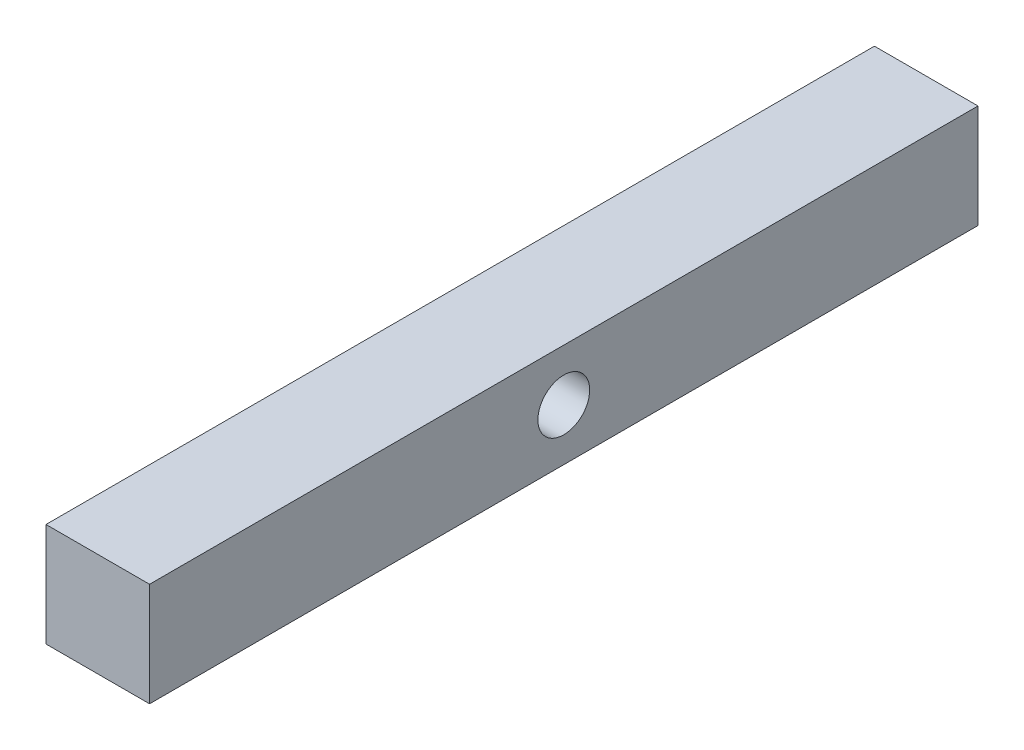
ISO-10303-21;
HEADER;
FILE_DESCRIPTION(('STEP AP214'),'2;1');
FILE_NAME('part.step','',(''),(''),'','','');
FILE_SCHEMA(('AUTOMOTIVE_DESIGN { 1 0 10303 214 1 1 1 1 }'));
ENDSEC;
DATA;
#1=APPLICATION_CONTEXT('core data for automotive mechanical design processes');
#2=APPLICATION_PROTOCOL_DEFINITION('international standard','automotive_design',2000,#1);
#3=PRODUCT_CONTEXT('',#1,'mechanical');
#4=PRODUCT('Part','Part','',(#3));
#5=PRODUCT_RELATED_PRODUCT_CATEGORY('part','',(#4));
#6=PRODUCT_DEFINITION_FORMATION('','',#4);
#7=PRODUCT_DEFINITION_CONTEXT('part definition',#1,'design');
#8=PRODUCT_DEFINITION('design','',#6,#7);
#9=PRODUCT_DEFINITION_SHAPE('','',#8);
#10=(LENGTH_UNIT() NAMED_UNIT(*) SI_UNIT(.MILLI.,.METRE.));
#11=(NAMED_UNIT(*) PLANE_ANGLE_UNIT() SI_UNIT($,.RADIAN.));
#12=(NAMED_UNIT(*) SI_UNIT($,.STERADIAN.) SOLID_ANGLE_UNIT());
#13=UNCERTAINTY_MEASURE_WITH_UNIT(LENGTH_MEASURE(1.E-05),#10,'distance_accuracy_value','');
#14=(GEOMETRIC_REPRESENTATION_CONTEXT(3) GLOBAL_UNCERTAINTY_ASSIGNED_CONTEXT((#13)) GLOBAL_UNIT_ASSIGNED_CONTEXT((#10,
#11,#12)) REPRESENTATION_CONTEXT('',''));
#15=CARTESIAN_POINT('',(0.,0.,0.));
#16=DIRECTION('',(0.,0.,1.));
#17=DIRECTION('',(1.,0.,0.));
#18=AXIS2_PLACEMENT_3D('',#15,#16,#17);
#19=CARTESIAN_POINT('',(20.,-20.,320.));
#20=DIRECTION('',(-1.,0.,0.));
#21=DIRECTION('',(0.,0.,1.));
#22=AXIS2_PLACEMENT_3D('',#19,#20,#21);
#23=PLANE('',#22);
#24=CARTESIAN_POINT('',(20.,0.,160.));
#25=DIRECTION('',(1.,0.,0.));
#26=DIRECTION('',(0.,0.,-1.));
#27=AXIS2_PLACEMENT_3D('',#24,#25,#26);
#28=CIRCLE('',#27,9.99999999999998);
#29=CARTESIAN_POINT('',(20.,0.,150.));
#30=VERTEX_POINT('',#29);
#31=EDGE_CURVE('E111',#30,#30,#28,.T.);
#32=ORIENTED_EDGE('',*,*,#31,.F.);
#33=EDGE_LOOP('',(#32));
#34=FACE_BOUND('',#33,.T.);
#35=DIRECTION('',(0.,1.,0.));
#36=VECTOR('',#35,1.);
#37=CARTESIAN_POINT('',(20.,-20.,0.));
#38=LINE('',#37,#36);
#39=CARTESIAN_POINT('',(20.,-20.,0.));
#40=VERTEX_POINT('',#39);
#41=CARTESIAN_POINT('',(20.,20.,0.));
#42=VERTEX_POINT('',#41);
#43=EDGE_CURVE('E98',#40,#42,#38,.T.);
#44=ORIENTED_EDGE('',*,*,#43,.T.);
#45=DIRECTION('',(0.,0.,-1.));
#46=VECTOR('',#45,1.);
#47=CARTESIAN_POINT('',(20.,20.,320.));
#48=LINE('',#47,#46);
#49=CARTESIAN_POINT('',(20.,20.,320.));
#50=VERTEX_POINT('',#49);
#51=EDGE_CURVE('E11',#50,#42,#48,.T.);
#52=ORIENTED_EDGE('',*,*,#51,.F.);
#53=DIRECTION('',(0.,1.,0.));
#54=VECTOR('',#53,1.);
#55=CARTESIAN_POINT('',(20.,-20.,320.));
#56=LINE('',#55,#54);
#57=CARTESIAN_POINT('',(20.,-20.,320.));
#58=VERTEX_POINT('',#57);
#59=EDGE_CURVE('E85',#58,#50,#56,.T.);
#60=ORIENTED_EDGE('',*,*,#59,.F.);
#61=DIRECTION('',(0.,0.,-1.));
#62=VECTOR('',#61,1.);
#63=CARTESIAN_POINT('',(20.,-20.,320.));
#64=LINE('',#63,#62);
#65=EDGE_CURVE('E94',#58,#40,#64,.T.);
#66=ORIENTED_EDGE('',*,*,#65,.T.);
#67=EDGE_LOOP('',(#44,#52,#60,#66));
#68=FACE_BOUND('',#67,.T.);
#69=ADVANCED_FACE('F33',(#34,#68),#23,.F.);
#70=CARTESIAN_POINT('',(-20.,20.,320.));
#71=DIRECTION('',(0.,-1.,0.));
#72=DIRECTION('',(0.,0.,-1.));
#73=AXIS2_PLACEMENT_3D('',#70,#71,#72);
#74=PLANE('',#73);
#75=DIRECTION('',(-1.,0.,0.));
#76=VECTOR('',#75,1.);
#77=CARTESIAN_POINT('',(-20.,20.,0.));
#78=LINE('',#77,#76);
#79=CARTESIAN_POINT('',(-20.,20.,0.));
#80=VERTEX_POINT('',#79);
#81=EDGE_CURVE('E89',#42,#80,#78,.T.);
#82=ORIENTED_EDGE('',*,*,#81,.T.);
#83=DIRECTION('',(0.,0.,-1.));
#84=VECTOR('',#83,1.);
#85=CARTESIAN_POINT('',(-20.,20.,320.));
#86=LINE('',#85,#84);
#87=CARTESIAN_POINT('',(-20.,20.,320.));
#88=VERTEX_POINT('',#87);
#89=EDGE_CURVE('E42',#88,#80,#86,.T.);
#90=ORIENTED_EDGE('',*,*,#89,.F.);
#91=DIRECTION('',(-1.,0.,0.));
#92=VECTOR('',#91,1.);
#93=CARTESIAN_POINT('',(-20.,20.,320.));
#94=LINE('',#93,#92);
#95=EDGE_CURVE('E80',#50,#88,#94,.T.);
#96=ORIENTED_EDGE('',*,*,#95,.F.);
#97=ORIENTED_EDGE('',*,*,#51,.T.);
#98=EDGE_LOOP('',(#82,#90,#96,#97));
#99=FACE_BOUND('',#98,.T.);
#100=ADVANCED_FACE('F88',(#99),#74,.F.);
#101=CARTESIAN_POINT('',(-20.,-20.,320.));
#102=DIRECTION('',(1.,0.,0.));
#103=DIRECTION('',(0.,0.,-1.));
#104=AXIS2_PLACEMENT_3D('',#101,#102,#103);
#105=PLANE('',#104);
#106=CARTESIAN_POINT('',(-20.,0.,160.));
#107=DIRECTION('',(1.,0.,0.));
#108=DIRECTION('',(0.,0.,-1.));
#109=AXIS2_PLACEMENT_3D('',#106,#107,#108);
#110=CIRCLE('',#109,9.99999999999998);
#111=CARTESIAN_POINT('',(-20.,0.,150.));
#112=VERTEX_POINT('',#111);
#113=EDGE_CURVE('E36',#112,#112,#110,.T.);
#114=ORIENTED_EDGE('',*,*,#113,.T.);
#115=EDGE_LOOP('',(#114));
#116=FACE_BOUND('',#115,.T.);
#117=DIRECTION('',(0.,-1.,0.));
#118=VECTOR('',#117,1.);
#119=CARTESIAN_POINT('',(-20.,-20.,0.));
#120=LINE('',#119,#118);
#121=CARTESIAN_POINT('',(-20.,-20.,0.));
#122=VERTEX_POINT('',#121);
#123=EDGE_CURVE('E67',#80,#122,#120,.T.);
#124=ORIENTED_EDGE('',*,*,#123,.T.);
#125=DIRECTION('',(0.,0.,-1.));
#126=VECTOR('',#125,1.);
#127=CARTESIAN_POINT('',(-20.,-20.,320.));
#128=LINE('',#127,#126);
#129=CARTESIAN_POINT('',(-20.,-20.,320.));
#130=VERTEX_POINT('',#129);
#131=EDGE_CURVE('E90',#130,#122,#128,.T.);
#132=ORIENTED_EDGE('',*,*,#131,.F.);
#133=DIRECTION('',(0.,-1.,0.));
#134=VECTOR('',#133,1.);
#135=CARTESIAN_POINT('',(-20.,-20.,320.));
#136=LINE('',#135,#134);
#137=EDGE_CURVE('E83',#88,#130,#136,.T.);
#138=ORIENTED_EDGE('',*,*,#137,.F.);
#139=ORIENTED_EDGE('',*,*,#89,.T.);
#140=EDGE_LOOP('',(#124,#132,#138,#139));
#141=FACE_BOUND('',#140,.T.);
#142=ADVANCED_FACE('F92',(#116,#141),#105,.F.);
#143=CARTESIAN_POINT('',(-20.,-20.,320.));
#144=DIRECTION('',(0.,1.,0.));
#145=DIRECTION('',(0.,0.,1.));
#146=AXIS2_PLACEMENT_3D('',#143,#144,#145);
#147=PLANE('',#146);
#148=DIRECTION('',(1.,0.,0.));
#149=VECTOR('',#148,1.);
#150=CARTESIAN_POINT('',(-20.,-20.,0.));
#151=LINE('',#150,#149);
#152=EDGE_CURVE('E73',#122,#40,#151,.T.);
#153=ORIENTED_EDGE('',*,*,#152,.T.);
#154=ORIENTED_EDGE('',*,*,#65,.F.);
#155=DIRECTION('',(1.,0.,0.));
#156=VECTOR('',#155,1.);
#157=CARTESIAN_POINT('',(-20.,-20.,320.));
#158=LINE('',#157,#156);
#159=EDGE_CURVE('E50',#130,#58,#158,.T.);
#160=ORIENTED_EDGE('',*,*,#159,.F.);
#161=ORIENTED_EDGE('',*,*,#131,.T.);
#162=EDGE_LOOP('',(#153,#154,#160,#161));
#163=FACE_BOUND('',#162,.T.);
#164=ADVANCED_FACE('F105',(#163),#147,.F.);
#165=CARTESIAN_POINT('',(0.,0.,320.));
#166=DIRECTION('',(0.,0.,-1.));
#167=DIRECTION('',(-1.,0.,0.));
#168=AXIS2_PLACEMENT_3D('',#165,#166,#167);
#169=PLANE('',#168);
#170=ORIENTED_EDGE('',*,*,#59,.T.);
#171=ORIENTED_EDGE('',*,*,#95,.T.);
#172=ORIENTED_EDGE('',*,*,#137,.T.);
#173=ORIENTED_EDGE('',*,*,#159,.T.);
#174=EDGE_LOOP('',(#170,#171,#172,#173));
#175=FACE_BOUND('',#174,.T.);
#176=ADVANCED_FACE('F81',(#175),#169,.F.);
#177=CARTESIAN_POINT('',(0.,0.,0.));
#178=DIRECTION('',(0.,0.,-1.));
#179=DIRECTION('',(-1.,0.,0.));
#180=AXIS2_PLACEMENT_3D('',#177,#178,#179);
#181=PLANE('',#180);
#182=ORIENTED_EDGE('',*,*,#43,.F.);
#183=ORIENTED_EDGE('',*,*,#152,.F.);
#184=ORIENTED_EDGE('',*,*,#123,.F.);
#185=ORIENTED_EDGE('',*,*,#81,.F.);
#186=EDGE_LOOP('',(#182,#183,#184,#185));
#187=FACE_BOUND('',#186,.T.);
#188=ADVANCED_FACE('F108',(#187),#181,.T.);
#189=CARTESIAN_POINT('',(-220.,0.,160.));
#190=DIRECTION('',(1.,0.,0.));
#191=DIRECTION('',(0.,0.,-1.));
#192=AXIS2_PLACEMENT_3D('',#189,#190,#191);
#193=CYLINDRICAL_SURFACE('',#192,9.99999999999998);
#194=ORIENTED_EDGE('',*,*,#31,.T.);
#195=EDGE_LOOP('',(#194));
#196=FACE_BOUND('',#195,.T.);
#197=ORIENTED_EDGE('',*,*,#113,.F.);
#198=EDGE_LOOP('',(#197));
#199=FACE_BOUND('',#198,.T.);
#200=ADVANCED_FACE('F119',(#196,#199),#193,.F.);
#201=CLOSED_SHELL('',(#69,#100,#142,#164,#176,#188,#200));
#202=MANIFOLD_SOLID_BREP('B2',#201);
#203=ADVANCED_BREP_SHAPE_REPRESENTATION('',(#18,#202),#14);
#204=SHAPE_DEFINITION_REPRESENTATION(#9,#203);
ENDSEC;
END-ISO-10303-21;
